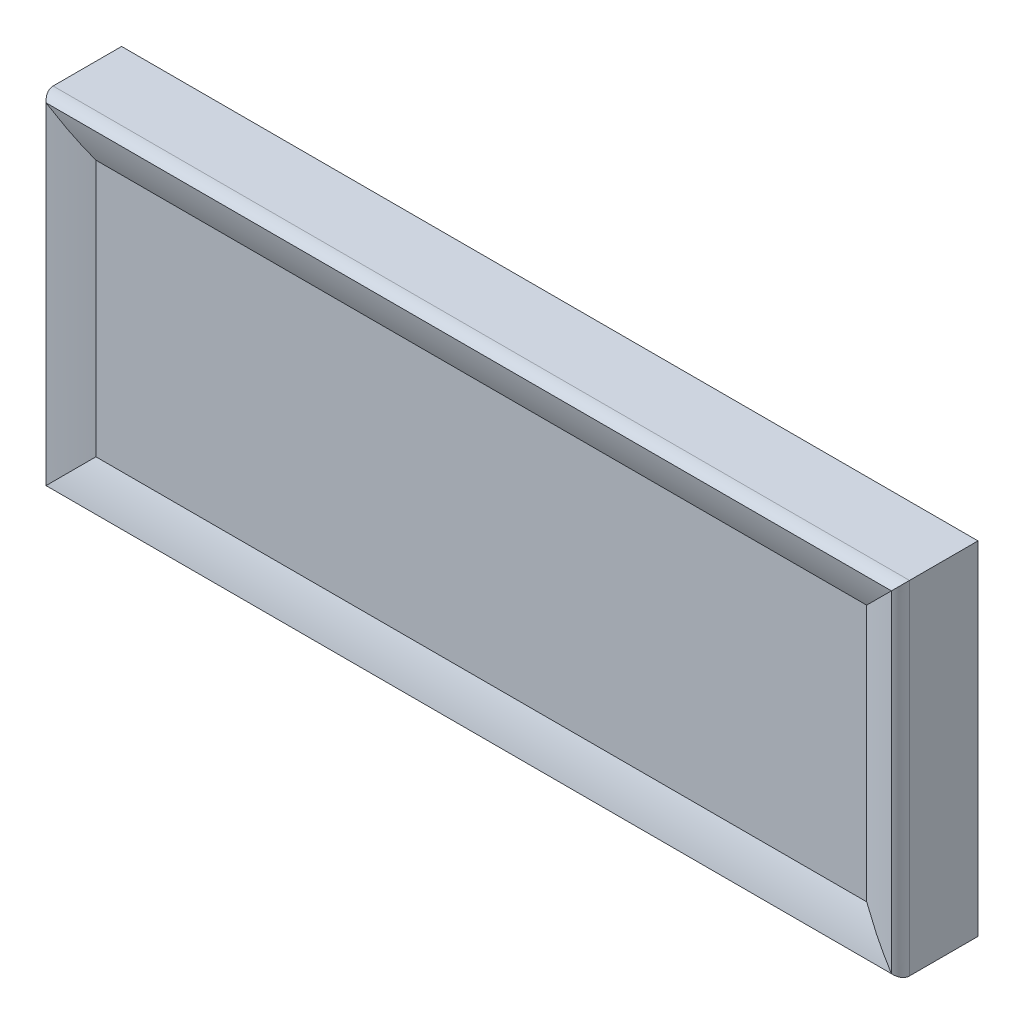
ISO-10303-21;
HEADER;
FILE_DESCRIPTION(('STEP AP214'),'2;1');
FILE_NAME('part.step','',(''),(''),'','','');
FILE_SCHEMA(('AUTOMOTIVE_DESIGN { 1 0 10303 214 1 1 1 1 }'));
ENDSEC;
DATA;
#1=APPLICATION_CONTEXT('core data for automotive mechanical design processes');
#2=APPLICATION_PROTOCOL_DEFINITION('international standard','automotive_design',2000,#1);
#3=PRODUCT_CONTEXT('',#1,'mechanical');
#4=PRODUCT('Part','Part','',(#3));
#5=PRODUCT_RELATED_PRODUCT_CATEGORY('part','',(#4));
#6=PRODUCT_DEFINITION_FORMATION('','',#4);
#7=PRODUCT_DEFINITION_CONTEXT('part definition',#1,'design');
#8=PRODUCT_DEFINITION('design','',#6,#7);
#9=PRODUCT_DEFINITION_SHAPE('','',#8);
#10=(LENGTH_UNIT() NAMED_UNIT(*) SI_UNIT(.MILLI.,.METRE.));
#11=(NAMED_UNIT(*) PLANE_ANGLE_UNIT() SI_UNIT($,.RADIAN.));
#12=(NAMED_UNIT(*) SI_UNIT($,.STERADIAN.) SOLID_ANGLE_UNIT());
#13=UNCERTAINTY_MEASURE_WITH_UNIT(LENGTH_MEASURE(1.E-05),#10,'distance_accuracy_value','');
#14=(GEOMETRIC_REPRESENTATION_CONTEXT(3) GLOBAL_UNCERTAINTY_ASSIGNED_CONTEXT((#13)) GLOBAL_UNIT_ASSIGNED_CONTEXT((#10,
#11,#12)) REPRESENTATION_CONTEXT('',''));
#15=CARTESIAN_POINT('',(0.,0.,0.));
#16=DIRECTION('',(0.,0.,1.));
#17=DIRECTION('',(1.,0.,0.));
#18=AXIS2_PLACEMENT_3D('',#15,#16,#17);
#19=CARTESIAN_POINT('',(25.,10.,5.));
#20=DIRECTION('',(-1.,0.,0.));
#21=DIRECTION('',(0.,-1.,0.));
#22=AXIS2_PLACEMENT_3D('',#19,#20,#21);
#23=PLANE('',#22);
#24=DIRECTION('',(0.,0.,-1.));
#25=VECTOR('',#24,1.);
#26=CARTESIAN_POINT('',(25.,10.,5.));
#27=LINE('',#26,#25);
#28=CARTESIAN_POINT('',(25.,10.,4.));
#29=VERTEX_POINT('',#28);
#30=CARTESIAN_POINT('',(25.,10.,0.));
#31=VERTEX_POINT('',#30);
#32=EDGE_CURVE('E399',#29,#31,#27,.T.);
#33=ORIENTED_EDGE('',*,*,#32,.F.);
#34=CARTESIAN_POINT('',(25.,-50.,4.));
#35=CARTESIAN_POINT('',(25.,-36.6666666666667,4.));
#36=CARTESIAN_POINT('',(25.,-23.3333333333333,4.));
#37=CARTESIAN_POINT('',(25.,-10.,4.));
#38=CARTESIAN_POINT('',(25.,-3.33333333333333,4.));
#39=CARTESIAN_POINT('',(25.,3.33333333333334,4.));
#40=CARTESIAN_POINT('',(25.,10.,4.));
#41=CARTESIAN_POINT('',(25.,23.3333333333333,4.));
#42=CARTESIAN_POINT('',(25.,36.6666666666667,4.));
#43=CARTESIAN_POINT('',(25.,50.,4.));
#44=(BOUNDED_CURVE() B_SPLINE_CURVE(3,(#34,#35,#36,#37,#38,#39,#40,#41,#42,#43),.UNSPECIFIED.,
.F.,.F.) B_SPLINE_CURVE_WITH_KNOTS((4,3,3,4),(-0.06,-0.02,0.,0.04),
.UNSPECIFIED.) CURVE() GEOMETRIC_REPRESENTATION_ITEM() RATIONAL_B_SPLINE_CURVE((1.,1.,1.,1.,1.,
1.,1.,1.,1.,1.)) REPRESENTATION_ITEM(''));
#45=CARTESIAN_POINT('',(25.,-10.,4.));
#46=VERTEX_POINT('',#45);
#47=EDGE_CURVE('E400',#29,#46,#44,.F.);
#48=ORIENTED_EDGE('',*,*,#47,.T.);
#49=DIRECTION('',(0.,0.,-1.));
#50=VECTOR('',#49,1.);
#51=CARTESIAN_POINT('',(25.,-10.,5.));
#52=LINE('',#51,#50);
#53=CARTESIAN_POINT('',(25.,-10.,0.));
#54=VERTEX_POINT('',#53);
#55=EDGE_CURVE('E611',#46,#54,#52,.T.);
#56=ORIENTED_EDGE('',*,*,#55,.T.);
#57=DIRECTION('',(0.,1.,0.));
#58=VECTOR('',#57,1.);
#59=CARTESIAN_POINT('',(25.,10.,0.));
#60=LINE('',#59,#58);
#61=EDGE_CURVE('E350',#54,#31,#60,.T.);
#62=ORIENTED_EDGE('',*,*,#61,.T.);
#63=EDGE_LOOP('',(#33,#48,#56,#62));
#64=FACE_BOUND('',#63,.T.);
#65=ADVANCED_FACE('F46',(#64),#23,.F.);
#66=CARTESIAN_POINT('',(-25.,10.,5.));
#67=DIRECTION('',(0.,-1.,0.));
#68=DIRECTION('',(0.,0.,-1.));
#69=AXIS2_PLACEMENT_3D('',#66,#67,#68);
#70=PLANE('',#69);
#71=DIRECTION('',(0.,0.,-1.));
#72=VECTOR('',#71,1.);
#73=CARTESIAN_POINT('',(-25.,10.,5.));
#74=LINE('',#73,#72);
#75=CARTESIAN_POINT('',(-25.,10.,4.));
#76=VERTEX_POINT('',#75);
#77=CARTESIAN_POINT('',(-25.,10.,0.));
#78=VERTEX_POINT('',#77);
#79=EDGE_CURVE('E405',#76,#78,#74,.T.);
#80=ORIENTED_EDGE('',*,*,#79,.F.);
#81=CARTESIAN_POINT('',(125.,10.,4.));
#82=CARTESIAN_POINT('',(91.6666666666667,10.,4.));
#83=CARTESIAN_POINT('',(58.3333333333333,10.,4.));
#84=CARTESIAN_POINT('',(25.,10.,4.));
#85=CARTESIAN_POINT('',(8.33333333333333,10.,4.));
#86=CARTESIAN_POINT('',(-8.33333333333334,10.,4.));
#87=CARTESIAN_POINT('',(-25.,10.,4.));
#88=CARTESIAN_POINT('',(-58.3333333333333,10.,4.));
#89=CARTESIAN_POINT('',(-91.6666666666667,10.,4.));
#90=CARTESIAN_POINT('',(-125.,10.,4.));
#91=(BOUNDED_CURVE() B_SPLINE_CURVE(3,(#81,#82,#83,#84,#85,#86,#87,#88,#89,#90),.UNSPECIFIED.,
.F.,.F.) B_SPLINE_CURVE_WITH_KNOTS((4,3,3,4),(-0.15,-0.05,0.,0.1),
.UNSPECIFIED.) CURVE() GEOMETRIC_REPRESENTATION_ITEM() RATIONAL_B_SPLINE_CURVE((1.,1.,1.,1.,1.,
1.,1.,1.,1.,1.)) REPRESENTATION_ITEM(''));
#92=EDGE_CURVE('E407',#76,#29,#91,.F.);
#93=ORIENTED_EDGE('',*,*,#92,.T.);
#94=ORIENTED_EDGE('',*,*,#32,.T.);
#95=DIRECTION('',(-1.,0.,0.));
#96=VECTOR('',#95,1.);
#97=CARTESIAN_POINT('',(-25.,10.,0.));
#98=LINE('',#97,#96);
#99=EDGE_CURVE('E641',#31,#78,#98,.T.);
#100=ORIENTED_EDGE('',*,*,#99,.T.);
#101=EDGE_LOOP('',(#80,#93,#94,#100));
#102=FACE_BOUND('',#101,.T.);
#103=ADVANCED_FACE('F390',(#102),#70,.F.);
#104=CARTESIAN_POINT('',(-25.,10.,5.));
#105=DIRECTION('',(1.,0.,0.));
#106=DIRECTION('',(0.,0.,-1.));
#107=AXIS2_PLACEMENT_3D('',#104,#105,#106);
#108=PLANE('',#107);
#109=DIRECTION('',(0.,0.,-1.));
#110=VECTOR('',#109,1.);
#111=CARTESIAN_POINT('',(-25.,-10.,5.));
#112=LINE('',#111,#110);
#113=CARTESIAN_POINT('',(-25.,-10.,4.));
#114=VERTEX_POINT('',#113);
#115=CARTESIAN_POINT('',(-25.,-10.,0.));
#116=VERTEX_POINT('',#115);
#117=EDGE_CURVE('E603',#114,#116,#112,.T.);
#118=ORIENTED_EDGE('',*,*,#117,.F.);
#119=CARTESIAN_POINT('',(-25.,50.,4.));
#120=CARTESIAN_POINT('',(-25.,36.6666666666667,4.));
#121=CARTESIAN_POINT('',(-25.,23.3333333333333,4.));
#122=CARTESIAN_POINT('',(-25.,10.,4.));
#123=CARTESIAN_POINT('',(-25.,3.33333333333335,4.));
#124=CARTESIAN_POINT('',(-25.,-3.33333333333332,4.));
#125=CARTESIAN_POINT('',(-25.,-9.99999999999999,4.));
#126=CARTESIAN_POINT('',(-25.,-23.3333333333333,4.));
#127=CARTESIAN_POINT('',(-25.,-36.6666666666667,4.));
#128=CARTESIAN_POINT('',(-25.,-50.,4.));
#129=(BOUNDED_CURVE() B_SPLINE_CURVE(3,(#119,#120,#121,#122,#123,#124,#125,#126,#127,#128),
.UNSPECIFIED.,.F.,.F.) B_SPLINE_CURVE_WITH_KNOTS((4,3,3,4),(-0.04,0.,0.02,0.06),
.UNSPECIFIED.) CURVE() GEOMETRIC_REPRESENTATION_ITEM() RATIONAL_B_SPLINE_CURVE((1.,1.,1.,1.,1.,
1.,1.,1.,1.,1.)) REPRESENTATION_ITEM(''));
#130=EDGE_CURVE('E605',#114,#76,#129,.F.);
#131=ORIENTED_EDGE('',*,*,#130,.T.);
#132=ORIENTED_EDGE('',*,*,#79,.T.);
#133=DIRECTION('',(0.,-1.,0.));
#134=VECTOR('',#133,1.);
#135=CARTESIAN_POINT('',(-25.,10.,0.));
#136=LINE('',#135,#134);
#137=EDGE_CURVE('E608',#78,#116,#136,.T.);
#138=ORIENTED_EDGE('',*,*,#137,.T.);
#139=EDGE_LOOP('',(#118,#131,#132,#138));
#140=FACE_BOUND('',#139,.T.);
#141=ADVANCED_FACE('F395',(#140),#108,.F.);
#142=CARTESIAN_POINT('',(-25.,-10.,5.));
#143=DIRECTION('',(0.,1.,0.));
#144=DIRECTION('',(0.,0.,1.));
#145=AXIS2_PLACEMENT_3D('',#142,#143,#144);
#146=PLANE('',#145);
#147=ORIENTED_EDGE('',*,*,#55,.F.);
#148=CARTESIAN_POINT('',(-125.,-10.,4.));
#149=CARTESIAN_POINT('',(-91.6666666666667,-10.,4.));
#150=CARTESIAN_POINT('',(-58.3333333333333,-10.,4.));
#151=CARTESIAN_POINT('',(-25.,-10.,4.));
#152=CARTESIAN_POINT('',(-8.33333333333332,-10.,4.));
#153=CARTESIAN_POINT('',(8.33333333333335,-10.,4.));
#154=CARTESIAN_POINT('',(25.,-10.,4.));
#155=CARTESIAN_POINT('',(58.3333333333334,-10.,4.));
#156=CARTESIAN_POINT('',(91.6666666666667,-10.,4.));
#157=CARTESIAN_POINT('',(125.,-10.,4.));
#158=(BOUNDED_CURVE() B_SPLINE_CURVE(3,(#148,#149,#150,#151,#152,#153,#154,#155,#156,#157),
.UNSPECIFIED.,.F.,.F.) B_SPLINE_CURVE_WITH_KNOTS((4,3,3,4),(-0.1,0.,0.05,0.15),
.UNSPECIFIED.) CURVE() GEOMETRIC_REPRESENTATION_ITEM() RATIONAL_B_SPLINE_CURVE((1.,1.,1.,1.,1.,
1.,1.,1.,1.,1.)) REPRESENTATION_ITEM(''));
#159=EDGE_CURVE('E278',#46,#114,#158,.F.);
#160=ORIENTED_EDGE('',*,*,#159,.T.);
#161=ORIENTED_EDGE('',*,*,#117,.T.);
#162=DIRECTION('',(1.,0.,0.));
#163=VECTOR('',#162,1.);
#164=CARTESIAN_POINT('',(-25.,-10.,0.));
#165=LINE('',#164,#163);
#166=EDGE_CURVE('E638',#116,#54,#165,.T.);
#167=ORIENTED_EDGE('',*,*,#166,.T.);
#168=EDGE_LOOP('',(#147,#160,#161,#167));
#169=FACE_BOUND('',#168,.T.);
#170=ADVANCED_FACE('F387',(#169),#146,.F.);
#171=CARTESIAN_POINT('',(0.,0.,0.));
#172=DIRECTION('',(0.,0.,1.));
#173=DIRECTION('',(1.,0.,0.));
#174=AXIS2_PLACEMENT_3D('',#171,#172,#173);
#175=PLANE('',#174);
#176=ORIENTED_EDGE('',*,*,#61,.F.);
#177=ORIENTED_EDGE('',*,*,#166,.F.);
#178=ORIENTED_EDGE('',*,*,#137,.F.);
#179=ORIENTED_EDGE('',*,*,#99,.F.);
#180=EDGE_LOOP('',(#176,#177,#178,#179));
#181=FACE_BOUND('',#180,.T.);
#182=ADVANCED_FACE('F169',(#181),#175,.F.);
#183=CARTESIAN_POINT('',(-24.,14.168,5.));
#184=CARTESIAN_POINT('',(-24.,12.7786666666667,5.));
#185=CARTESIAN_POINT('',(-24.,11.3893333333333,5.));
#186=CARTESIAN_POINT('',(-24.,10.,5.));
#187=CARTESIAN_POINT('',(-24.,3.33333333333335,5.));
#188=CARTESIAN_POINT('',(-24.,-3.33333333333332,5.));
#189=CARTESIAN_POINT('',(-24.,-9.99999999999999,5.));
#190=CARTESIAN_POINT('',(-24.,-11.3893333333333,5.));
#191=CARTESIAN_POINT('',(-24.,-12.7786666666667,5.));
#192=CARTESIAN_POINT('',(-24.,-14.168,5.));
#193=CARTESIAN_POINT('',(-25.,14.168,5.));
#194=CARTESIAN_POINT('',(-25.,12.7786666666667,5.));
#195=CARTESIAN_POINT('',(-25.,11.3893333333333,5.));
#196=CARTESIAN_POINT('',(-25.,10.,5.));
#197=CARTESIAN_POINT('',(-25.,3.33333333333335,5.));
#198=CARTESIAN_POINT('',(-25.,-3.33333333333332,5.));
#199=CARTESIAN_POINT('',(-25.,-9.99999999999999,5.));
#200=CARTESIAN_POINT('',(-25.,-11.3893333333333,5.));
#201=CARTESIAN_POINT('',(-25.,-12.7786666666667,5.));
#202=CARTESIAN_POINT('',(-25.,-14.168,5.));
#203=CARTESIAN_POINT('',(-25.,14.168,4.));
#204=CARTESIAN_POINT('',(-25.,12.7786666666667,4.));
#205=CARTESIAN_POINT('',(-25.,11.3893333333333,4.));
#206=CARTESIAN_POINT('',(-25.,10.,4.));
#207=CARTESIAN_POINT('',(-25.,3.33333333333335,4.));
#208=CARTESIAN_POINT('',(-25.,-3.33333333333332,4.));
#209=CARTESIAN_POINT('',(-25.,-9.99999999999999,4.));
#210=CARTESIAN_POINT('',(-25.,-11.3893333333333,4.));
#211=CARTESIAN_POINT('',(-25.,-12.7786666666667,4.));
#212=CARTESIAN_POINT('',(-25.,-14.168,4.));
#213=(BOUNDED_SURFACE() B_SPLINE_SURFACE(2,3,((#183,#184,#185,#186,#187,#188,#189,#190,#191,
#192),(#193,#194,#195,#196,#197,#198,#199,#200,#201,#202),(#203,#204,#205,#206,#207,#208,#209,
#210,#211,#212)),.UNSPECIFIED.,.F.,.F.,.F.) B_SPLINE_SURFACE_WITH_KNOTS((3,3),(4,3,3,4),(0.,1.),
(-0.00416799999999999,0.,0.02,0.024168),
.UNSPECIFIED.) GEOMETRIC_REPRESENTATION_ITEM() RATIONAL_B_SPLINE_SURFACE(((1.,1.,1.,1.,1.,1.,1.,
1.,1.,1.),(0.707106781186548,0.707106781186548,0.707106781186548,0.707106781186548,
0.707106781186548,0.707106781186548,0.707106781186548,0.707106781186547,0.707106781186547,
0.707106781186547),(1.,1.,1.,1.,1.,1.,1.,1.,1.,1.))) REPRESENTATION_ITEM('') SURFACE());
#214=CARTESIAN_POINT('',(-25.,-10.,4.));
#215=CARTESIAN_POINT('',(-25.0000030280565,-10.0000030280565,4.02243252743322));
#216=CARTESIAN_POINT('',(-24.9992445090996,-9.99924450909966,4.04485119388084));
#217=CARTESIAN_POINT('',(-24.9962397778471,-9.99623977784712,4.0894710387714));
#218=CARTESIAN_POINT('',(-24.9939947299421,-9.9939947299421,4.11167237364787));
#219=CARTESIAN_POINT('',(-24.9851369433984,-9.98513694339842,4.17730438672846));
#220=CARTESIAN_POINT('',(-24.9764000530369,-9.97640005303693,4.22019157335714));
#221=CARTESIAN_POINT('',(-24.9539385439945,-9.95393854399451,4.30306063968412));
#222=CARTESIAN_POINT('',(-24.9402276443665,-9.9402276443665,4.34305015109428));
#223=CARTESIAN_POINT('',(-24.9086320129088,-9.90863201290882,4.41965424065308));
#224=CARTESIAN_POINT('',(-24.8907378534415,-9.89073785344154,4.45626093114841));
#225=CARTESIAN_POINT('',(-24.8436221180181,-9.84362211801811,4.53986156899779));
#226=CARTESIAN_POINT('',(-24.8127574566784,-9.81275745667841,4.5850012067991));
#227=CARTESIAN_POINT('',(-24.7463244925176,-9.74632449251764,4.66770127746888));
#228=CARTESIAN_POINT('',(-24.7107473091862,-9.71074730918616,4.70524705391033));
#229=CARTESIAN_POINT('',(-24.6219281670451,-9.62192816704507,4.78618006154996));
#230=CARTESIAN_POINT('',(-24.5671686578558,-9.56716865785589,4.82622746344237));
#231=CARTESIAN_POINT('',(-24.4538797107647,-9.45387971076458,4.89349933023959));
#232=CARTESIAN_POINT('',(-24.3953458545464,-9.39534585454602,4.92070844489882));
#233=CARTESIAN_POINT('',(-24.2816276412659,-9.28162764126621,4.96124281698466));
#234=CARTESIAN_POINT('',(-24.2266237861852,-9.2266237861863,4.97560690461874));
#235=CARTESIAN_POINT('',(-24.1158878703532,-9.11588787035211,4.99484628917619));
#236=CARTESIAN_POINT('',(-24.0601575485732,-9.06015754856895,4.9997411258881));
#237=CARTESIAN_POINT('',(-24.0029813888138,-9.00298138881356,4.99999666252605));
#238=CARTESIAN_POINT('',(-24.0014906738579,-9.00149067385784,4.99999999543511));
#239=CARTESIAN_POINT('',(-23.9999999999999,-8.99999999999994,5.));
#240=B_SPLINE_CURVE_WITH_KNOTS('',3,(#214,#215,#216,#217,#218,#219,#220,#221,#222,#223,#224,
#225,#226,#227,#228,#229,#230,#231,#232,#233,#234,#235,#236,#237,#238,#239),.UNSPECIFIED.,.F.,
.F.,(4,2,2,2,2,2,2,2,2,2,2,2,4),(0.,0.0672457396048309,0.134438868172214,0.267559824129508,
0.40031637010864,0.533375038354728,0.720712178250309,0.90840750598996,1.16855696340393,
1.42901668818515,1.66575363888481,1.90200155988639,1.90832612311249),.UNSPECIFIED.);
#241=CARTESIAN_POINT('',(-24.6789523888368,-9.6789523888368,4.73418230275639));
#242=VERTEX_POINT('',#241);
#243=EDGE_CURVE('E286',#242,#114,#240,.F.);
#244=CARTESIAN_POINT('',(-24.6789554182199,-14.168,4.73417950125967));
#245=CARTESIAN_POINT('',(-24.6789554182199,-12.7786666666667,4.73417950125967));
#246=CARTESIAN_POINT('',(-24.6789554182199,-11.3893333333333,4.73417950125967));
#247=CARTESIAN_POINT('',(-24.6789554182199,-9.99999999999999,4.73417950125967));
#248=CARTESIAN_POINT('',(-24.6789554182199,-3.33333333333332,4.73417950125967));
#249=CARTESIAN_POINT('',(-24.6789554182199,3.33333333333335,4.73417950125967));
#250=CARTESIAN_POINT('',(-24.6789554182199,10.,4.73417950125967));
#251=CARTESIAN_POINT('',(-24.6789554182199,11.3893333333333,4.73417950125967));
#252=CARTESIAN_POINT('',(-24.6789554182199,12.7786666666667,4.73417950125967));
#253=CARTESIAN_POINT('',(-24.6789554182199,14.168,4.73417950125967));
#254=(BOUNDED_CURVE() B_SPLINE_CURVE(3,(#244,#245,#246,#247,#248,#249,#250,#251,#252,#253),
.UNSPECIFIED.,.F.,.F.) B_SPLINE_CURVE_WITH_KNOTS((4,3,3,4),(-0.00416799999999998,0.,
0.0200000000000001,0.024168),
.UNSPECIFIED.) CURVE() GEOMETRIC_REPRESENTATION_ITEM() RATIONAL_B_SPLINE_CURVE((0.85387902406398,
0.85387902406398,0.85387902406398,0.85387902406398,0.85387902406398,0.85387902406398,
0.85387902406398,0.85387902406398,0.85387902406398,0.85387902406398)) REPRESENTATION_ITEM(''));
#255=CARTESIAN_POINT('',(-24.6789523888339,9.67895238883388,4.73418230275576));
#256=VERTEX_POINT('',#255);
#257=EDGE_CURVE('E61',#242,#256,#254,.T.);
#258=CARTESIAN_POINT('',(-25.,10.,4.));
#259=CARTESIAN_POINT('',(-25.0000030280565,10.0000030280565,4.02243252743322));
#260=CARTESIAN_POINT('',(-24.9992445090996,9.99924450909966,4.04485119388084));
#261=CARTESIAN_POINT('',(-24.9962397778471,9.99623977784712,4.0894710387714));
#262=CARTESIAN_POINT('',(-24.9939947299421,9.9939947299421,4.11167237364787));
#263=CARTESIAN_POINT('',(-24.9851369433984,9.98513694339842,4.17730438672846));
#264=CARTESIAN_POINT('',(-24.9764000530369,9.97640005303693,4.22019157335714));
#265=CARTESIAN_POINT('',(-24.9539385439945,9.95393854399451,4.30306063968412));
#266=CARTESIAN_POINT('',(-24.9402276443665,9.9402276443665,4.34305015109428));
#267=CARTESIAN_POINT('',(-24.9086320129088,9.90863201290881,4.41965424065308));
#268=CARTESIAN_POINT('',(-24.8907378534415,9.89073785344154,4.45626093114841));
#269=CARTESIAN_POINT('',(-24.8436221180181,9.84362211801811,4.53986156899779));
#270=CARTESIAN_POINT('',(-24.8127574566784,9.8127574566784,4.5850012067991));
#271=CARTESIAN_POINT('',(-24.7463244925176,9.74632449251764,4.66770127746889));
#272=CARTESIAN_POINT('',(-24.7107473091862,9.71074730918615,4.70524705391033));
#273=CARTESIAN_POINT('',(-24.621928167045,9.62192816704508,4.78618006154996));
#274=CARTESIAN_POINT('',(-24.5671686578558,9.56716865785593,4.82622746344236));
#275=CARTESIAN_POINT('',(-24.4538797107647,9.45387971076454,4.89349933023959));
#276=CARTESIAN_POINT('',(-24.3953458545465,9.39534585454588,4.92070844489883));
#277=CARTESIAN_POINT('',(-24.2816276412658,9.28162764126633,4.96124281698466));
#278=CARTESIAN_POINT('',(-24.2266237861847,9.22662378618675,4.97560690461873));
#279=CARTESIAN_POINT('',(-24.1158878703537,9.11588787035166,4.9948462891762));
#280=CARTESIAN_POINT('',(-24.0601575485748,9.06015754856725,4.99974112588814));
#281=CARTESIAN_POINT('',(-24.0029813888139,9.00298138881347,4.99999666252605));
#282=CARTESIAN_POINT('',(-24.001490673858,9.00149067385779,4.99999999543511));
#283=CARTESIAN_POINT('',(-23.9999999999999,8.99999999999993,5.));
#284=B_SPLINE_CURVE_WITH_KNOTS('',3,(#258,#259,#260,#261,#262,#263,#264,#265,#266,#267,#268,
#269,#270,#271,#272,#273,#274,#275,#276,#277,#278,#279,#280,#281,#282,#283),.UNSPECIFIED.,.F.,
.F.,(4,2,2,2,2,2,2,2,2,2,2,2,4),(0.,0.0672457396048318,0.134438868172214,0.267559824129508,
0.400316370108641,0.533375038354729,0.720712178250312,0.908407505989959,1.16855696340393,
1.42901668818515,1.66575363888482,1.90200155988639,1.90832612311249),.UNSPECIFIED.);
#285=EDGE_CURVE('E284',#76,#256,#284,.T.);
#286=ORIENTED_EDGE('',*,*,#243,.F.);
#287=ORIENTED_EDGE('',*,*,#257,.T.);
#288=ORIENTED_EDGE('',*,*,#285,.F.);
#289=ORIENTED_EDGE('',*,*,#130,.F.);
#290=EDGE_LOOP('',(#286,#287,#288,#289));
#291=FACE_BOUND('',#290,.T.);
#292=ADVANCED_FACE('F364',(#291),#213,.T.);
#293=CARTESIAN_POINT('',(-35.4200000000001,-9.,5.));
#294=CARTESIAN_POINT('',(-31.9466666666667,-9.,5.));
#295=CARTESIAN_POINT('',(-28.4733333333333,-9.,5.));
#296=CARTESIAN_POINT('',(-25.,-9.,5.));
#297=CARTESIAN_POINT('',(-8.33333333333332,-9.,5.));
#298=CARTESIAN_POINT('',(8.33333333333335,-9.,5.));
#299=CARTESIAN_POINT('',(25.,-9.,5.));
#300=CARTESIAN_POINT('',(28.4733333333334,-9.,5.));
#301=CARTESIAN_POINT('',(31.9466666666667,-9.,5.));
#302=CARTESIAN_POINT('',(35.42,-9.,5.));
#303=CARTESIAN_POINT('',(-35.42,-10.,5.));
#304=CARTESIAN_POINT('',(-31.9466666666667,-10.,5.));
#305=CARTESIAN_POINT('',(-28.4733333333333,-10.,5.));
#306=CARTESIAN_POINT('',(-25.,-10.,5.));
#307=CARTESIAN_POINT('',(-8.33333333333332,-10.,5.));
#308=CARTESIAN_POINT('',(8.33333333333335,-10.,5.));
#309=CARTESIAN_POINT('',(25.,-10.,5.));
#310=CARTESIAN_POINT('',(28.4733333333334,-10.,5.));
#311=CARTESIAN_POINT('',(31.9466666666667,-10.,5.));
#312=CARTESIAN_POINT('',(35.42,-10.,5.));
#313=CARTESIAN_POINT('',(-35.4200000000001,-10.,4.));
#314=CARTESIAN_POINT('',(-31.9466666666667,-10.,4.));
#315=CARTESIAN_POINT('',(-28.4733333333333,-10.,4.));
#316=CARTESIAN_POINT('',(-25.,-10.,4.));
#317=CARTESIAN_POINT('',(-8.33333333333332,-10.,4.));
#318=CARTESIAN_POINT('',(8.33333333333335,-10.,4.));
#319=CARTESIAN_POINT('',(25.,-10.,4.));
#320=CARTESIAN_POINT('',(28.4733333333334,-10.,4.));
#321=CARTESIAN_POINT('',(31.9466666666667,-10.,4.));
#322=CARTESIAN_POINT('',(35.42,-10.,4.));
#323=(BOUNDED_SURFACE() B_SPLINE_SURFACE(2,3,((#293,#294,#295,#296,#297,#298,#299,#300,#301,
#302),(#303,#304,#305,#306,#307,#308,#309,#310,#311,#312),(#313,#314,#315,#316,#317,#318,#319,
#320,#321,#322)),.UNSPECIFIED.,.F.,.F.,.F.) B_SPLINE_SURFACE_WITH_KNOTS((3,3),(4,3,3,4),(0.,1.),
(-0.0104200000000001,0.,0.05,0.06042),
.UNSPECIFIED.) GEOMETRIC_REPRESENTATION_ITEM() RATIONAL_B_SPLINE_SURFACE(((1.,1.,1.,1.,1.,1.,1.,
1.,1.,1.),(0.707106781186547,0.707106781186547,0.707106781186547,0.707106781186548,
0.707106781186548,0.707106781186548,0.707106781186548,0.707106781186548,0.707106781186548,
0.707106781186548),(1.,1.,1.,1.,1.,1.,1.,1.,1.,1.))) REPRESENTATION_ITEM('') SURFACE());
#324=CARTESIAN_POINT('',(25.,-10.,4.));
#325=CARTESIAN_POINT('',(25.0000030280565,-10.0000030280565,4.02243252743322));
#326=CARTESIAN_POINT('',(24.9992445090997,-9.99924450909966,4.04485119388084));
#327=CARTESIAN_POINT('',(24.9962397778471,-9.99623977784712,4.0894710387714));
#328=CARTESIAN_POINT('',(24.9939947299421,-9.99399472994211,4.11167237364788));
#329=CARTESIAN_POINT('',(24.9851369433984,-9.98513694339842,4.17730438672846));
#330=CARTESIAN_POINT('',(24.9764000530369,-9.97640005303693,4.22019157335714));
#331=CARTESIAN_POINT('',(24.9539385439945,-9.95393854399451,4.30306063968412));
#332=CARTESIAN_POINT('',(24.9402276443665,-9.9402276443665,4.34305015109429));
#333=CARTESIAN_POINT('',(24.9086320129088,-9.90863201290882,4.41965424065308));
#334=CARTESIAN_POINT('',(24.8907378534416,-9.89073785344154,4.45626093114842));
#335=CARTESIAN_POINT('',(24.8436221180181,-9.84362211801811,4.53986156899779));
#336=CARTESIAN_POINT('',(24.8127574566784,-9.8127574566784,4.5850012067991));
#337=CARTESIAN_POINT('',(24.7463244925177,-9.74632449251765,4.66770127746889));
#338=CARTESIAN_POINT('',(24.7107473091862,-9.71074730918617,4.70524705391033));
#339=CARTESIAN_POINT('',(24.6219281670451,-9.62192816704506,4.78618006154996));
#340=CARTESIAN_POINT('',(24.5671686578559,-9.56716865785581,4.82622746344237));
#341=CARTESIAN_POINT('',(24.4538797107646,-9.45387971076468,4.89349933023959));
#342=CARTESIAN_POINT('',(24.395345854546,-9.39534585454638,4.92070844489882));
#343=CARTESIAN_POINT('',(24.2816276412662,-9.28162764126589,4.96124281698466));
#344=CARTESIAN_POINT('',(24.2266237861863,-9.22662378618515,4.97560690461874));
#345=CARTESIAN_POINT('',(24.1158878703521,-9.11588787035327,4.99484628917619));
#346=CARTESIAN_POINT('',(24.0601575485689,-9.06015754857322,4.99974112588809));
#347=CARTESIAN_POINT('',(24.0029813888136,-9.00298138881379,4.99999666252605));
#348=CARTESIAN_POINT('',(24.0014906738578,-9.00149067385795,4.99999999543511));
#349=CARTESIAN_POINT('',(23.9999999999999,-8.99999999999994,5.));
#350=B_SPLINE_CURVE_WITH_KNOTS('',3,(#324,#325,#326,#327,#328,#329,#330,#331,#332,#333,#334,
#335,#336,#337,#338,#339,#340,#341,#342,#343,#344,#345,#346,#347,#348,#349),.UNSPECIFIED.,.F.,
.F.,(4,2,2,2,2,2,2,2,2,2,2,2,4),(0.,0.0672457396048326,0.134438868172214,0.267559824129511,
0.400316370108643,0.533375038354728,0.720712178250312,0.908407505989965,1.16855696340394,
1.42901668818515,1.66575363888481,1.90200155988639,1.90832612311249),.UNSPECIFIED.);
#351=CARTESIAN_POINT('',(24.6789523888368,-9.67895238883683,4.73418230275641));
#352=VERTEX_POINT('',#351);
#353=EDGE_CURVE('E275',#352,#46,#350,.F.);
#354=CARTESIAN_POINT('',(35.42,-9.67895541821984,4.73417950125969));
#355=CARTESIAN_POINT('',(31.9466666666667,-9.67895541821984,4.73417950125969));
#356=CARTESIAN_POINT('',(28.4733333333334,-9.67895541821984,4.73417950125969));
#357=CARTESIAN_POINT('',(25.,-9.67895541821984,4.73417950125969));
#358=CARTESIAN_POINT('',(8.33333333333335,-9.67895541821984,4.73417950125969));
#359=CARTESIAN_POINT('',(-8.33333333333332,-9.67895541821984,4.73417950125969));
#360=CARTESIAN_POINT('',(-25.,-9.67895541821984,4.73417950125969));
#361=CARTESIAN_POINT('',(-28.4733333333333,-9.67895541821984,4.73417950125969));
#362=CARTESIAN_POINT('',(-31.9466666666667,-9.67895541821984,4.73417950125969));
#363=CARTESIAN_POINT('',(-35.4200000000001,-9.67895541821984,4.73417950125969));
#364=(BOUNDED_CURVE() B_SPLINE_CURVE(3,(#354,#355,#356,#357,#358,#359,#360,#361,#362,#363),
.UNSPECIFIED.,.F.,.F.) B_SPLINE_CURVE_WITH_KNOTS((4,3,3,4),(-0.0104200000000001,0.,
0.0499999999999999,0.06042),
.UNSPECIFIED.) CURVE() GEOMETRIC_REPRESENTATION_ITEM() RATIONAL_B_SPLINE_CURVE((0.853879024063981,
0.853879024063981,0.853879024063981,0.853879024063981,0.853879024063981,0.853879024063981,
0.853879024063981,0.853879024063981,0.853879024063981,0.853879024063981)) REPRESENTATION_ITEM(''));
#365=EDGE_CURVE('E76',#352,#242,#364,.T.);
#366=ORIENTED_EDGE('',*,*,#353,.F.);
#367=ORIENTED_EDGE('',*,*,#365,.T.);
#368=ORIENTED_EDGE('',*,*,#243,.T.);
#369=ORIENTED_EDGE('',*,*,#159,.F.);
#370=EDGE_LOOP('',(#366,#367,#368,#369));
#371=FACE_BOUND('',#370,.T.);
#372=ADVANCED_FACE('F281',(#371),#323,.T.);
#373=CARTESIAN_POINT('',(35.4200000000001,9.,5.));
#374=CARTESIAN_POINT('',(31.9466666666667,9.,5.));
#375=CARTESIAN_POINT('',(28.4733333333334,9.,5.));
#376=CARTESIAN_POINT('',(25.,9.,5.));
#377=CARTESIAN_POINT('',(8.33333333333333,9.,5.));
#378=CARTESIAN_POINT('',(-8.33333333333334,9.,5.));
#379=CARTESIAN_POINT('',(-25.,9.,5.));
#380=CARTESIAN_POINT('',(-28.4733333333333,9.,5.));
#381=CARTESIAN_POINT('',(-31.9466666666667,9.,5.));
#382=CARTESIAN_POINT('',(-35.42,9.,5.));
#383=CARTESIAN_POINT('',(35.4200000000001,10.,5.));
#384=CARTESIAN_POINT('',(31.9466666666667,10.,5.));
#385=CARTESIAN_POINT('',(28.4733333333334,10.,5.));
#386=CARTESIAN_POINT('',(25.,10.,5.));
#387=CARTESIAN_POINT('',(8.33333333333333,10.,5.));
#388=CARTESIAN_POINT('',(-8.33333333333334,10.,5.));
#389=CARTESIAN_POINT('',(-25.,10.,5.));
#390=CARTESIAN_POINT('',(-28.4733333333333,10.,5.));
#391=CARTESIAN_POINT('',(-31.9466666666667,10.,5.));
#392=CARTESIAN_POINT('',(-35.42,10.,5.));
#393=CARTESIAN_POINT('',(35.4200000000001,10.,4.));
#394=CARTESIAN_POINT('',(31.9466666666667,10.,4.));
#395=CARTESIAN_POINT('',(28.4733333333334,10.,4.));
#396=CARTESIAN_POINT('',(25.,10.,4.));
#397=CARTESIAN_POINT('',(8.33333333333333,10.,4.));
#398=CARTESIAN_POINT('',(-8.33333333333334,10.,4.));
#399=CARTESIAN_POINT('',(-25.,10.,4.));
#400=CARTESIAN_POINT('',(-28.4733333333333,10.,4.));
#401=CARTESIAN_POINT('',(-31.9466666666667,10.,4.));
#402=CARTESIAN_POINT('',(-35.42,10.,4.));
#403=(BOUNDED_SURFACE() B_SPLINE_SURFACE(2,3,((#373,#374,#375,#376,#377,#378,#379,#380,#381,
#382),(#383,#384,#385,#386,#387,#388,#389,#390,#391,#392),(#393,#394,#395,#396,#397,#398,#399,
#400,#401,#402)),.UNSPECIFIED.,.F.,.F.,.F.) B_SPLINE_SURFACE_WITH_KNOTS((3,3),(4,3,3,4),(0.,1.),
(-0.0604200000000001,-0.05,0.,0.01042),
.UNSPECIFIED.) GEOMETRIC_REPRESENTATION_ITEM() RATIONAL_B_SPLINE_SURFACE(((1.,1.,1.,1.,1.,1.,1.,
1.,1.,1.),(0.707106781186548,0.707106781186548,0.707106781186548,0.707106781186548,
0.707106781186548,0.707106781186548,0.707106781186548,0.707106781186547,0.707106781186547,
0.707106781186547),(1.,1.,1.,1.,1.,1.,1.,1.,1.,1.))) REPRESENTATION_ITEM('') SURFACE());
#404=CARTESIAN_POINT('',(-35.42,9.67895541821987,4.73417950125966));
#405=CARTESIAN_POINT('',(-31.9466666666667,9.67895541821987,4.73417950125966));
#406=CARTESIAN_POINT('',(-28.4733333333333,9.67895541821987,4.73417950125966));
#407=CARTESIAN_POINT('',(-25.,9.67895541821987,4.73417950125966));
#408=CARTESIAN_POINT('',(-8.33333333333334,9.67895541821987,4.73417950125966));
#409=CARTESIAN_POINT('',(8.33333333333333,9.67895541821987,4.73417950125966));
#410=CARTESIAN_POINT('',(25.,9.67895541821987,4.73417950125966));
#411=CARTESIAN_POINT('',(28.4733333333334,9.67895541821987,4.73417950125966));
#412=CARTESIAN_POINT('',(31.9466666666667,9.67895541821987,4.73417950125966));
#413=CARTESIAN_POINT('',(35.4200000000001,9.67895541821987,4.73417950125966));
#414=(BOUNDED_CURVE() B_SPLINE_CURVE(3,(#404,#405,#406,#407,#408,#409,#410,#411,#412,#413),
.UNSPECIFIED.,.F.,.F.) B_SPLINE_CURVE_WITH_KNOTS((4,3,3,4),(-0.0604200000000001,
-0.0500000000000001,0.,0.01042),
.UNSPECIFIED.) CURVE() GEOMETRIC_REPRESENTATION_ITEM() RATIONAL_B_SPLINE_CURVE((0.85387902406398,
0.85387902406398,0.85387902406398,0.85387902406398,0.85387902406398,0.85387902406398,
0.85387902406398,0.85387902406398,0.85387902406398,0.85387902406398)) REPRESENTATION_ITEM(''));
#415=CARTESIAN_POINT('',(24.6789523888339,9.67895238883392,4.73418230275575));
#416=VERTEX_POINT('',#415);
#417=EDGE_CURVE('E12',#256,#416,#414,.T.);
#418=CARTESIAN_POINT('',(25.,10.,4.));
#419=CARTESIAN_POINT('',(25.0000030280565,10.0000030280565,4.02243252743322));
#420=CARTESIAN_POINT('',(24.9992445090997,9.99924450909966,4.04485119388084));
#421=CARTESIAN_POINT('',(24.9962397778471,9.99623977784712,4.0894710387714));
#422=CARTESIAN_POINT('',(24.9939947299421,9.9939947299421,4.11167237364787));
#423=CARTESIAN_POINT('',(24.9851369433984,9.98513694339842,4.17730438672846));
#424=CARTESIAN_POINT('',(24.976400053037,9.97640005303693,4.22019157335714));
#425=CARTESIAN_POINT('',(24.9539385439945,9.9539385439945,4.30306063968412));
#426=CARTESIAN_POINT('',(24.9402276443665,9.9402276443665,4.34305015109429));
#427=CARTESIAN_POINT('',(24.9086320129088,9.90863201290881,4.41965424065308));
#428=CARTESIAN_POINT('',(24.8907378534416,9.89073785344154,4.45626093114841));
#429=CARTESIAN_POINT('',(24.8436221180181,9.8436221180181,4.53986156899779));
#430=CARTESIAN_POINT('',(24.8127574566784,9.8127574566784,4.5850012067991));
#431=CARTESIAN_POINT('',(24.7463244925177,9.74632449251764,4.66770127746889));
#432=CARTESIAN_POINT('',(24.7107473091862,9.71074730918616,4.70524705391033));
#433=CARTESIAN_POINT('',(24.6219281670451,9.62192816704507,4.78618006154996));
#434=CARTESIAN_POINT('',(24.5671686578558,9.56716865785586,4.82622746344237));
#435=CARTESIAN_POINT('',(24.4538797107647,9.45387971076461,4.89349933023959));
#436=CARTESIAN_POINT('',(24.3953458545463,9.39534585454613,4.92070844489883));
#437=CARTESIAN_POINT('',(24.281627641266,9.28162764126611,4.96124281698466));
#438=CARTESIAN_POINT('',(24.2266237861855,9.22662378618594,4.97560690461873));
#439=CARTESIAN_POINT('',(24.1158878703529,9.11588787035245,4.9948462891762));
#440=CARTESIAN_POINT('',(24.0601575485719,9.06015754857023,4.99974112588812));
#441=CARTESIAN_POINT('',(24.0029813888137,9.00298138881362,4.99999666252605));
#442=CARTESIAN_POINT('',(24.0014906738579,9.00149067385787,4.9999999954351));
#443=CARTESIAN_POINT('',(24.,8.99999999999993,5.));
#444=B_SPLINE_CURVE_WITH_KNOTS('',3,(#418,#419,#420,#421,#422,#423,#424,#425,#426,#427,#428,
#429,#430,#431,#432,#433,#434,#435,#436,#437,#438,#439,#440,#441,#442,#443),.UNSPECIFIED.,.F.,
.F.,(4,2,2,2,2,2,2,2,2,2,2,2,4),(0.,0.0672457396048326,0.134438868172215,0.267559824129509,
0.400316370108643,0.533375038354731,0.720712178250314,0.908407505989967,1.16855696340394,
1.42901668818515,1.66575363888482,1.90200155988639,1.90832612311249),.UNSPECIFIED.);
#445=EDGE_CURVE('E198',#29,#416,#444,.T.);
#446=ORIENTED_EDGE('',*,*,#285,.T.);
#447=ORIENTED_EDGE('',*,*,#417,.T.);
#448=ORIENTED_EDGE('',*,*,#445,.F.);
#449=ORIENTED_EDGE('',*,*,#92,.F.);
#450=EDGE_LOOP('',(#446,#447,#448,#449));
#451=FACE_BOUND('',#450,.T.);
#452=ADVANCED_FACE('F330',(#451),#403,.T.);
#453=CARTESIAN_POINT('',(24.,-14.168,5.));
#454=CARTESIAN_POINT('',(24.,-12.7786666666667,5.));
#455=CARTESIAN_POINT('',(24.,-11.3893333333333,5.));
#456=CARTESIAN_POINT('',(24.,-10.,5.));
#457=CARTESIAN_POINT('',(24.,-3.33333333333333,5.));
#458=CARTESIAN_POINT('',(24.,3.33333333333334,5.));
#459=CARTESIAN_POINT('',(24.,10.,5.));
#460=CARTESIAN_POINT('',(24.,11.3893333333333,5.));
#461=CARTESIAN_POINT('',(24.,12.7786666666667,5.));
#462=CARTESIAN_POINT('',(24.,14.168,5.));
#463=CARTESIAN_POINT('',(25.,-14.168,5.));
#464=CARTESIAN_POINT('',(25.,-12.7786666666667,5.));
#465=CARTESIAN_POINT('',(25.,-11.3893333333333,5.));
#466=CARTESIAN_POINT('',(25.,-10.,5.));
#467=CARTESIAN_POINT('',(25.,-3.33333333333333,5.));
#468=CARTESIAN_POINT('',(25.,3.33333333333334,5.));
#469=CARTESIAN_POINT('',(25.,10.,5.));
#470=CARTESIAN_POINT('',(25.,11.3893333333333,5.));
#471=CARTESIAN_POINT('',(25.,12.7786666666667,5.));
#472=CARTESIAN_POINT('',(25.,14.168,5.));
#473=CARTESIAN_POINT('',(25.,-14.168,4.));
#474=CARTESIAN_POINT('',(25.,-12.7786666666667,4.));
#475=CARTESIAN_POINT('',(25.,-11.3893333333333,4.));
#476=CARTESIAN_POINT('',(25.,-10.,4.));
#477=CARTESIAN_POINT('',(25.,-3.33333333333333,4.));
#478=CARTESIAN_POINT('',(25.,3.33333333333334,4.));
#479=CARTESIAN_POINT('',(25.,10.,4.));
#480=CARTESIAN_POINT('',(25.,11.3893333333333,4.));
#481=CARTESIAN_POINT('',(25.,12.7786666666667,4.));
#482=CARTESIAN_POINT('',(25.,14.168,4.));
#483=(BOUNDED_SURFACE() B_SPLINE_SURFACE(2,3,((#453,#454,#455,#456,#457,#458,#459,#460,#461,
#462),(#463,#464,#465,#466,#467,#468,#469,#470,#471,#472),(#473,#474,#475,#476,#477,#478,#479,
#480,#481,#482)),.UNSPECIFIED.,.F.,.F.,.F.) B_SPLINE_SURFACE_WITH_KNOTS((3,3),(4,3,3,4),(0.,1.),
(-0.024168,-0.02,0.,0.00416799999999999),
.UNSPECIFIED.) GEOMETRIC_REPRESENTATION_ITEM() RATIONAL_B_SPLINE_SURFACE(((1.,1.,1.,1.,1.,1.,1.,
1.,1.,1.),(0.707106781186548,0.707106781186548,0.707106781186548,0.707106781186548,
0.707106781186548,0.707106781186548,0.707106781186548,0.707106781186548,0.707106781186548,
0.707106781186548),(1.,1.,1.,1.,1.,1.,1.,1.,1.,1.))) REPRESENTATION_ITEM('') SURFACE());
#484=CARTESIAN_POINT('',(24.6789554182199,14.168,4.73417950125969));
#485=CARTESIAN_POINT('',(24.6789554182199,12.7786666666667,4.73417950125969));
#486=CARTESIAN_POINT('',(24.6789554182199,11.3893333333333,4.73417950125969));
#487=CARTESIAN_POINT('',(24.6789554182199,10.,4.73417950125969));
#488=CARTESIAN_POINT('',(24.6789554182199,3.33333333333334,4.73417950125969));
#489=CARTESIAN_POINT('',(24.6789554182199,-3.33333333333333,4.73417950125969));
#490=CARTESIAN_POINT('',(24.6789554182199,-10.,4.73417950125969));
#491=CARTESIAN_POINT('',(24.6789554182199,-11.3893333333333,4.73417950125969));
#492=CARTESIAN_POINT('',(24.6789554182199,-12.7786666666667,4.73417950125969));
#493=CARTESIAN_POINT('',(24.6789554182199,-14.168,4.73417950125969));
#494=(BOUNDED_CURVE() B_SPLINE_CURVE(3,(#484,#485,#486,#487,#488,#489,#490,#491,#492,#493),
.UNSPECIFIED.,.F.,.F.) B_SPLINE_CURVE_WITH_KNOTS((4,3,3,4),(-0.024168,-0.02,0.,
0.00416799999999999),
.UNSPECIFIED.) CURVE() GEOMETRIC_REPRESENTATION_ITEM() RATIONAL_B_SPLINE_CURVE((0.853879024063981,
0.853879024063981,0.853879024063981,0.853879024063981,0.853879024063981,0.853879024063981,
0.853879024063981,0.853879024063981,0.853879024063981,0.853879024063981)) REPRESENTATION_ITEM(''));
#495=EDGE_CURVE('E129',#416,#352,#494,.T.);
#496=ORIENTED_EDGE('',*,*,#445,.T.);
#497=ORIENTED_EDGE('',*,*,#495,.T.);
#498=ORIENTED_EDGE('',*,*,#353,.T.);
#499=ORIENTED_EDGE('',*,*,#47,.F.);
#500=EDGE_LOOP('',(#496,#497,#498,#499));
#501=FACE_BOUND('',#500,.T.);
#502=ADVANCED_FACE('F168',(#501),#483,.T.);
#503=CARTESIAN_POINT('',(0.,0.,4.));
#504=DIRECTION('',(0.,0.,1.));
#505=DIRECTION('',(1.,0.,0.));
#506=AXIS2_PLACEMENT_3D('',#503,#504,#505);
#507=PLANE('',#506);
#508=CARTESIAN_POINT('',(22.5000000000001,20.35,4.00000000000002));
#509=CARTESIAN_POINT('',(22.5000000000001,6.78333333333333,4.00000000000002));
#510=CARTESIAN_POINT('',(22.5000000000001,-6.78333333333333,4.00000000000002));
#511=CARTESIAN_POINT('',(22.5000000000001,-20.35,4.00000000000002));
#512=(BOUNDED_CURVE() B_SPLINE_CURVE(3,(#508,#509,#510,#511),.UNSPECIFIED.,.F.,
.F.) B_SPLINE_CURVE_WITH_KNOTS((4,4),(-0.02785,0.01285),
.UNSPECIFIED.) CURVE() GEOMETRIC_REPRESENTATION_ITEM() RATIONAL_B_SPLINE_CURVE((0.999999999999999,
0.999999999999999,0.999999999999999,0.999999999999999)) REPRESENTATION_ITEM(''));
#513=CARTESIAN_POINT('',(22.5,-7.5,4.));
#514=VERTEX_POINT('',#513);
#515=CARTESIAN_POINT('',(22.5,7.5,4.));
#516=VERTEX_POINT('',#515);
#517=EDGE_CURVE('E126',#514,#516,#512,.F.);
#518=ORIENTED_EDGE('',*,*,#517,.T.);
#519=CARTESIAN_POINT('',(-36.5291287847478,7.5,4.));
#520=CARTESIAN_POINT('',(-14.3155176965973,7.5,4.));
#521=CARTESIAN_POINT('',(7.89809339155311,7.5,4.));
#522=CARTESIAN_POINT('',(30.1117044797036,7.5,4.));
#523=(BOUNDED_CURVE() B_SPLINE_CURVE(3,(#519,#520,#521,#522),.UNSPECIFIED.,.F.,
.F.) B_SPLINE_CURVE_WITH_KNOTS((4,4),(-0.0526117044797036,0.0140291287847478),
.UNSPECIFIED.) CURVE() GEOMETRIC_REPRESENTATION_ITEM() RATIONAL_B_SPLINE_CURVE((1.,1.,1.,1.)) REPRESENTATION_ITEM(''));
#524=CARTESIAN_POINT('',(-22.5,7.5,4.));
#525=VERTEX_POINT('',#524);
#526=EDGE_CURVE('E138',#516,#525,#523,.F.);
#527=ORIENTED_EDGE('',*,*,#526,.T.);
#528=CARTESIAN_POINT('',(-22.5,-13.2908332644514,4.));
#529=CARTESIAN_POINT('',(-22.5,-4.43027775481714,4.));
#530=CARTESIAN_POINT('',(-22.5,4.43027775481715,4.));
#531=CARTESIAN_POINT('',(-22.5,13.2908332644514,4.));
#532=(BOUNDED_CURVE() B_SPLINE_CURVE(3,(#528,#529,#530,#531),.UNSPECIFIED.,.F.,
.F.) B_SPLINE_CURVE_WITH_KNOTS((4,4),(-0.00579083326445143,0.0207908332644514),
.UNSPECIFIED.) CURVE() GEOMETRIC_REPRESENTATION_ITEM() RATIONAL_B_SPLINE_CURVE((1.,1.,1.,1.)) REPRESENTATION_ITEM(''));
#533=CARTESIAN_POINT('',(-22.5,-7.5,4.));
#534=VERTEX_POINT('',#533);
#535=EDGE_CURVE('E147',#525,#534,#532,.F.);
#536=ORIENTED_EDGE('',*,*,#535,.T.);
#537=CARTESIAN_POINT('',(30.1117044797036,-7.5,4.));
#538=CARTESIAN_POINT('',(7.89809339155311,-7.5,4.));
#539=CARTESIAN_POINT('',(-14.3155176965973,-7.5,4.));
#540=CARTESIAN_POINT('',(-36.5291287847478,-7.5,4.));
#541=(BOUNDED_CURVE() B_SPLINE_CURVE(3,(#537,#538,#539,#540),.UNSPECIFIED.,.F.,
.F.) B_SPLINE_CURVE_WITH_KNOTS((4,4),(-0.0140291287847478,0.0526117044797036),
.UNSPECIFIED.) CURVE() GEOMETRIC_REPRESENTATION_ITEM() RATIONAL_B_SPLINE_CURVE((1.,1.,1.,1.)) REPRESENTATION_ITEM(''));
#542=EDGE_CURVE('E152',#534,#514,#541,.F.);
#543=ORIENTED_EDGE('',*,*,#542,.T.);
#544=EDGE_LOOP('',(#518,#527,#536,#543));
#545=FACE_BOUND('',#544,.T.);
#546=ADVANCED_FACE('F150',(#545),#507,.T.);
#547=CARTESIAN_POINT('',(-22.5,13.2908332644514,4.));
#548=CARTESIAN_POINT('',(-22.5,4.43027775481715,4.));
#549=CARTESIAN_POINT('',(-22.5,-4.43027775481714,4.));
#550=CARTESIAN_POINT('',(-22.5,-13.2908332644514,4.));
#551=CARTESIAN_POINT('',(-24.6821789023599,13.2908332644514,5.));
#552=CARTESIAN_POINT('',(-24.6821789023599,4.43027775481715,5.));
#553=CARTESIAN_POINT('',(-24.6821789023599,-4.43027775481715,5.));
#554=CARTESIAN_POINT('',(-24.6821789023599,-13.2908332644514,5.));
#555=CARTESIAN_POINT('',(-27.0825756949558,13.2908332644514,5.));
#556=CARTESIAN_POINT('',(-27.0825756949558,4.43027775481714,5.));
#557=CARTESIAN_POINT('',(-27.0825756949558,-4.43027775481714,5.));
#558=CARTESIAN_POINT('',(-27.0825756949558,-13.2908332644514,5.));
#559=(BOUNDED_SURFACE() B_SPLINE_SURFACE(2,3,((#547,#548,#549,#550),(#551,#552,#553,#554),(#555,
#556,#557,#558)),.UNSPECIFIED.,.F.,.F.,.F.) B_SPLINE_SURFACE_WITH_KNOTS((3,3),(4,4),(0.,1.),
(-0.00579083326445143,0.0207908332644514),
.UNSPECIFIED.) GEOMETRIC_REPRESENTATION_ITEM() RATIONAL_B_SPLINE_SURFACE(((1.,1.,1.,1.),
(0.977008420918394,0.977008420918394,0.977008420918394,0.977008420918394),(1.,1.,1.,1.))) REPRESENTATION_ITEM('') SURFACE());
#560=CARTESIAN_POINT('',(-24.6789554182199,9.6789554182199,4.7341795012597));
#561=CARTESIAN_POINT('',(-24.5745699674302,9.57456780652588,4.7108048294072));
#562=CARTESIAN_POINT('',(-24.4703807761181,9.47033350984467,4.68586536642972));
#563=CARTESIAN_POINT('',(-24.2658435137899,9.26567369804746,4.63371263011505));
#564=CARTESIAN_POINT('',(-24.1654818957846,9.1652357492996,4.60660122534387));
#565=CARTESIAN_POINT('',(-23.9685985750718,8.96821654771714,4.55039805955745));
#566=CARTESIAN_POINT('',(-23.8720629296876,8.87162086760562,4.52140573155787));
#567=CARTESIAN_POINT('',(-23.6828325492005,8.68231191671055,4.46172562296247));
#568=CARTESIAN_POINT('',(-23.5901232406843,8.58958267347713,4.43113471769245));
#569=CARTESIAN_POINT('',(-23.4085460990214,8.40801361219092,4.36853275266717));
#570=CARTESIAN_POINT('',(-23.3196628947511,8.31915667856116,4.33661592751671));
#571=CARTESIAN_POINT('',(-23.1457391896551,8.14532180557652,4.27162635657416));
#572=CARTESIAN_POINT('',(-23.0606822931008,8.06032603689894,4.2386451827881));
#573=CARTESIAN_POINT('',(-22.8944114384095,7.8941884607044,4.17177997393085));
#574=CARTESIAN_POINT('',(-22.8131798715752,7.81302850568014,4.13798484447688));
#575=CARTESIAN_POINT('',(-22.6545643132603,7.65452175138733,4.06973022536086));
#576=CARTESIAN_POINT('',(-22.5771610650784,7.57715700555186,4.03535712748352));
#577=CARTESIAN_POINT('',(-22.5,7.5,4.));
#578=B_SPLINE_CURVE_WITH_KNOTS('',3,(#560,#561,#562,#563,#564,#565,#566,#567,#568,#569,#570,
#571,#572,#573,#574,#575,#576,#577),.UNSPECIFIED.,.F.,.F.,(4,2,2,2,2,2,2,2,4),(0.,
0.448384137071813,0.88200893696936,1.30080441906274,1.70471602405139,2.09370374737963,
2.46774125662395,2.82681501721335,3.17092345031327),.UNSPECIFIED.);
#579=EDGE_CURVE('E142',#256,#525,#578,.T.);
#580=CARTESIAN_POINT('',(-22.5,-7.5,4.));
#581=CARTESIAN_POINT('',(-22.5771610650785,-7.57715700555203,4.03535712748359));
#582=CARTESIAN_POINT('',(-22.6545643132606,-7.65452175138765,4.06973022536101));
#583=CARTESIAN_POINT('',(-22.8131798715758,-7.81302850568081,4.13798484447717));
#584=CARTESIAN_POINT('',(-22.8944114384104,-7.89418846070525,4.1717799739312));
#585=CARTESIAN_POINT('',(-23.0606822931021,-8.06032603690019,4.23864518278859));
#586=CARTESIAN_POINT('',(-23.1457391896565,-8.14532180557797,4.27162635657472));
#587=CARTESIAN_POINT('',(-23.319662894753,-8.31915667856304,4.3366159275174));
#588=CARTESIAN_POINT('',(-23.4085460990235,-8.40801361219303,4.36853275266792));
#589=CARTESIAN_POINT('',(-23.5901232406869,-8.58958267347972,4.43113471769332));
#590=CARTESIAN_POINT('',(-23.6828325492034,-8.68231191671339,4.4617256229634));
#591=CARTESIAN_POINT('',(-23.872062929691,-8.87162086760899,4.5214057315589));
#592=CARTESIAN_POINT('',(-23.9685985750755,-8.96821654772079,4.55039805955852));
#593=CARTESIAN_POINT('',(-24.1654818957888,-9.16523574930382,4.60660122534503));
#594=CARTESIAN_POINT('',(-24.2658435137944,-9.26567369805198,4.63371263011624));
#595=CARTESIAN_POINT('',(-24.4703807761233,-9.4703335098498,4.68586536643098));
#596=CARTESIAN_POINT('',(-24.5745699674356,-9.57456780653133,4.71080482940848));
#597=CARTESIAN_POINT('',(-24.6789554182257,-9.67895541822566,4.73417950126099));
#598=B_SPLINE_CURVE_WITH_KNOTS('',3,(#580,#581,#582,#583,#584,#585,#586,#587,#588,#589,#590,
#591,#592,#593,#594,#595,#596,#597),.UNSPECIFIED.,.F.,.F.,(4,2,2,2,2,2,2,2,4),(0.,
0.344108433100633,0.70318219369085,1.07721970293606,1.46620742626528,1.87011903125501,
2.28891451334956,2.72253931324837,3.17092345032152),.UNSPECIFIED.);
#599=EDGE_CURVE('E155',#534,#242,#598,.T.);
#600=ORIENTED_EDGE('',*,*,#579,.F.);
#601=ORIENTED_EDGE('',*,*,#257,.F.);
#602=ORIENTED_EDGE('',*,*,#599,.F.);
#603=ORIENTED_EDGE('',*,*,#535,.F.);
#604=EDGE_LOOP('',(#600,#601,#602,#603));
#605=FACE_BOUND('',#604,.T.);
#606=ADVANCED_FACE('F49',(#605),#559,.T.);
#607=CARTESIAN_POINT('',(-36.5291287847478,-7.5,4.));
#608=CARTESIAN_POINT('',(-14.3155176965973,-7.5,4.));
#609=CARTESIAN_POINT('',(7.89809339155311,-7.5,4.));
#610=CARTESIAN_POINT('',(30.1117044797036,-7.5,4.));
#611=CARTESIAN_POINT('',(-36.5291287847478,-9.68217890235993,5.00000000000001));
#612=CARTESIAN_POINT('',(-14.3155176965973,-9.68217890235993,5.00000000000001));
#613=CARTESIAN_POINT('',(7.89809339155314,-9.68217890235993,5.00000000000001));
#614=CARTESIAN_POINT('',(30.1117044797036,-9.68217890235993,5.00000000000001));
#615=CARTESIAN_POINT('',(-36.5291287847478,-12.0825756949558,5.));
#616=CARTESIAN_POINT('',(-14.3155176965973,-12.0825756949558,5.));
#617=CARTESIAN_POINT('',(7.89809339155313,-12.0825756949558,5.));
#618=CARTESIAN_POINT('',(30.1117044797036,-12.0825756949558,5.));
#619=(BOUNDED_SURFACE() B_SPLINE_SURFACE(2,3,((#607,#608,#609,#610),(#611,#612,#613,#614),(#615,
#616,#617,#618)),.UNSPECIFIED.,.F.,.F.,.F.) B_SPLINE_SURFACE_WITH_KNOTS((3,3),(4,4),(0.,1.),
(-0.0140291287847478,0.0526117044797036),
.UNSPECIFIED.) GEOMETRIC_REPRESENTATION_ITEM() RATIONAL_B_SPLINE_SURFACE(((1.,1.,1.,1.),
(0.977008420918394,0.977008420918394,0.977008420918394,0.977008420918394),(1.,1.,1.,1.))) REPRESENTATION_ITEM('') SURFACE());
#620=CARTESIAN_POINT('',(22.5,-7.5,4.));
#621=CARTESIAN_POINT('',(22.577157005552,-7.57716106507852,4.03535712748359));
#622=CARTESIAN_POINT('',(22.6545217513877,-7.65456431326064,4.06973022536101));
#623=CARTESIAN_POINT('',(22.8130285056808,-7.81317987157586,4.13798484447717));
#624=CARTESIAN_POINT('',(22.8941884607053,-7.89441143841041,4.17177997393121));
#625=CARTESIAN_POINT('',(23.0603260369002,-8.06068229310213,4.2386451827886));
#626=CARTESIAN_POINT('',(23.145321805578,-8.14573918965659,4.27162635657473));
#627=CARTESIAN_POINT('',(23.3191566785631,-8.31966289475305,4.33661592751742));
#628=CARTESIAN_POINT('',(23.4080136121931,-8.4085460990235,4.36853275266794));
#629=CARTESIAN_POINT('',(23.5895826734798,-8.59012324068699,4.43113471769334));
#630=CARTESIAN_POINT('',(23.6823119167134,-8.68283254920343,4.46172562296342));
#631=CARTESIAN_POINT('',(23.871620867609,-8.87206292969107,4.52140573155892));
#632=CARTESIAN_POINT('',(23.9682165477208,-8.96859857507554,4.55039805955854));
#633=CARTESIAN_POINT('',(24.1652357493039,-9.1654818957889,4.60660122534504));
#634=CARTESIAN_POINT('',(24.265673698052,-9.26584351379449,4.63371263011626));
#635=CARTESIAN_POINT('',(24.4703335098499,-9.47038077612333,4.68586536643099));
#636=CARTESIAN_POINT('',(24.5745678065314,-9.5745699674357,4.71080482940849));
#637=CARTESIAN_POINT('',(24.6789554182257,-9.67895541822572,4.734179501261));
#638=B_SPLINE_CURVE_WITH_KNOTS('',3,(#620,#621,#622,#623,#624,#625,#626,#627,#628,#629,#630,
#631,#632,#633,#634,#635,#636,#637),.UNSPECIFIED.,.F.,.F.,(4,2,2,2,2,2,2,2,4),(0.,
0.344108433100655,0.703182193690886,1.07721970293611,1.46620742626535,1.87011903125508,
2.28891451334964,2.72253931324845,3.17092345032161),.UNSPECIFIED.);
#639=EDGE_CURVE('E134',#514,#352,#638,.T.);
#640=ORIENTED_EDGE('',*,*,#599,.T.);
#641=ORIENTED_EDGE('',*,*,#365,.F.);
#642=ORIENTED_EDGE('',*,*,#639,.F.);
#643=ORIENTED_EDGE('',*,*,#542,.F.);
#644=EDGE_LOOP('',(#640,#641,#642,#643));
#645=FACE_BOUND('',#644,.T.);
#646=ADVANCED_FACE('F196',(#645),#619,.T.);
#647=CARTESIAN_POINT('',(30.1117044797036,7.5,4.));
#648=CARTESIAN_POINT('',(7.89809339155311,7.5,4.));
#649=CARTESIAN_POINT('',(-14.3155176965973,7.5,4.));
#650=CARTESIAN_POINT('',(-36.5291287847478,7.5,4.));
#651=CARTESIAN_POINT('',(30.1117044797036,9.68217890235992,5.00000000000001));
#652=CARTESIAN_POINT('',(7.89809339155314,9.68217890235992,5.00000000000001));
#653=CARTESIAN_POINT('',(-14.3155176965973,9.68217890235992,5.00000000000001));
#654=CARTESIAN_POINT('',(-36.5291287847478,9.68217890235992,5.00000000000001));
#655=CARTESIAN_POINT('',(30.1117044797036,12.0825756949558,5.));
#656=CARTESIAN_POINT('',(7.89809339155313,12.0825756949558,5.));
#657=CARTESIAN_POINT('',(-14.3155176965973,12.0825756949558,5.));
#658=CARTESIAN_POINT('',(-36.5291287847478,12.0825756949558,5.));
#659=(BOUNDED_SURFACE() B_SPLINE_SURFACE(2,3,((#647,#648,#649,#650),(#651,#652,#653,#654),(#655,
#656,#657,#658)),.UNSPECIFIED.,.F.,.F.,.F.) B_SPLINE_SURFACE_WITH_KNOTS((3,3),(4,4),(0.,1.),
(-0.0526117044797036,0.0140291287847478),
.UNSPECIFIED.) GEOMETRIC_REPRESENTATION_ITEM() RATIONAL_B_SPLINE_SURFACE(((1.,1.,1.,1.),
(0.977008420918394,0.977008420918394,0.977008420918394,0.977008420918394),(1.,1.,1.,1.))) REPRESENTATION_ITEM('') SURFACE());
#660=CARTESIAN_POINT('',(24.6789554182199,9.67895541821987,4.73417950125969));
#661=CARTESIAN_POINT('',(24.5745678065259,9.57456996743017,4.7108048294072));
#662=CARTESIAN_POINT('',(24.4703335098447,9.47038077611813,4.68586536642972));
#663=CARTESIAN_POINT('',(24.2656736980475,9.2658435137899,4.63371263011504));
#664=CARTESIAN_POINT('',(24.1652357492996,9.16548189578461,4.60660122534386));
#665=CARTESIAN_POINT('',(23.9682165477171,8.96859857507183,4.55039805955744));
#666=CARTESIAN_POINT('',(23.8716208676056,8.87206292968763,4.52140573155787));
#667=CARTESIAN_POINT('',(23.6823119167105,8.68283254920052,4.46172562296247));
#668=CARTESIAN_POINT('',(23.5895826734771,8.59012324068434,4.43113471769245));
#669=CARTESIAN_POINT('',(23.4080136121909,8.40854609902134,4.36853275266717));
#670=CARTESIAN_POINT('',(23.3191566785612,8.31966289475112,4.33661592751672));
#671=CARTESIAN_POINT('',(23.1453218055765,8.1457391896551,4.27162635657416));
#672=CARTESIAN_POINT('',(23.0603260368989,8.06068229310084,4.2386451827881));
#673=CARTESIAN_POINT('',(22.8941884607044,7.89441143840953,4.17177997393085));
#674=CARTESIAN_POINT('',(22.8130285056801,7.81317987157517,4.13798484447688));
#675=CARTESIAN_POINT('',(22.6545217513873,7.6545643132603,4.06973022536086));
#676=CARTESIAN_POINT('',(22.5771570055519,7.57716106507835,4.03535712748352));
#677=CARTESIAN_POINT('',(22.5,7.5,4.));
#678=B_SPLINE_CURVE_WITH_KNOTS('',3,(#660,#661,#662,#663,#664,#665,#666,#667,#668,#669,#670,
#671,#672,#673,#674,#675,#676,#677),.UNSPECIFIED.,.F.,.F.,(4,2,2,2,2,2,2,2,4),(0.,
0.448384137071802,0.882008936969347,1.30080441906273,1.70471602405137,2.09370374737961,
2.46774125662392,2.82681501721333,3.17092345031325),.UNSPECIFIED.);
#679=EDGE_CURVE('E121',#416,#516,#678,.T.);
#680=ORIENTED_EDGE('',*,*,#579,.T.);
#681=ORIENTED_EDGE('',*,*,#526,.F.);
#682=ORIENTED_EDGE('',*,*,#679,.F.);
#683=ORIENTED_EDGE('',*,*,#417,.F.);
#684=EDGE_LOOP('',(#680,#681,#682,#683));
#685=FACE_BOUND('',#684,.T.);
#686=ADVANCED_FACE('F140',(#685),#659,.T.);
#687=CARTESIAN_POINT('',(22.5,-20.35,4.));
#688=CARTESIAN_POINT('',(22.5,-6.78333333333333,4.));
#689=CARTESIAN_POINT('',(22.5,6.78333333333333,4.));
#690=CARTESIAN_POINT('',(22.5,20.35,4.));
#691=CARTESIAN_POINT('',(24.6821789023599,-20.35,5.));
#692=CARTESIAN_POINT('',(24.6821789023599,-6.78333333333333,5.));
#693=CARTESIAN_POINT('',(24.6821789023599,6.78333333333333,5.));
#694=CARTESIAN_POINT('',(24.6821789023599,20.35,5.));
#695=CARTESIAN_POINT('',(27.0825756949558,-20.35,5.));
#696=CARTESIAN_POINT('',(27.0825756949558,-6.78333333333333,5.));
#697=CARTESIAN_POINT('',(27.0825756949558,6.78333333333333,5.));
#698=CARTESIAN_POINT('',(27.0825756949558,20.35,5.));
#699=(BOUNDED_SURFACE() B_SPLINE_SURFACE(2,3,((#687,#688,#689,#690),(#691,#692,#693,#694),(#695,
#696,#697,#698)),.UNSPECIFIED.,.F.,.F.,.F.) B_SPLINE_SURFACE_WITH_KNOTS((3,3),(4,4),(0.,1.),
(-0.02785,0.01285),
.UNSPECIFIED.) GEOMETRIC_REPRESENTATION_ITEM() RATIONAL_B_SPLINE_SURFACE(((1.,1.,1.,1.),
(0.977008420918394,0.977008420918394,0.977008420918394,0.977008420918394),(1.,1.,1.,1.))) REPRESENTATION_ITEM('') SURFACE());
#700=ORIENTED_EDGE('',*,*,#639,.T.);
#701=ORIENTED_EDGE('',*,*,#495,.F.);
#702=ORIENTED_EDGE('',*,*,#679,.T.);
#703=ORIENTED_EDGE('',*,*,#517,.F.);
#704=EDGE_LOOP('',(#700,#701,#702,#703));
#705=FACE_BOUND('',#704,.T.);
#706=ADVANCED_FACE('F124',(#705),#699,.T.);
#707=CLOSED_SHELL('',(#65,#103,#141,#170,#182,#292,#372,#452,#502,#546,#606,#646,#686,#706));
#708=MANIFOLD_SOLID_BREP('B2',#707);
#709=ADVANCED_BREP_SHAPE_REPRESENTATION('',(#18,#708),#14);
#710=SHAPE_DEFINITION_REPRESENTATION(#9,#709);
ENDSEC;
END-ISO-10303-21;
